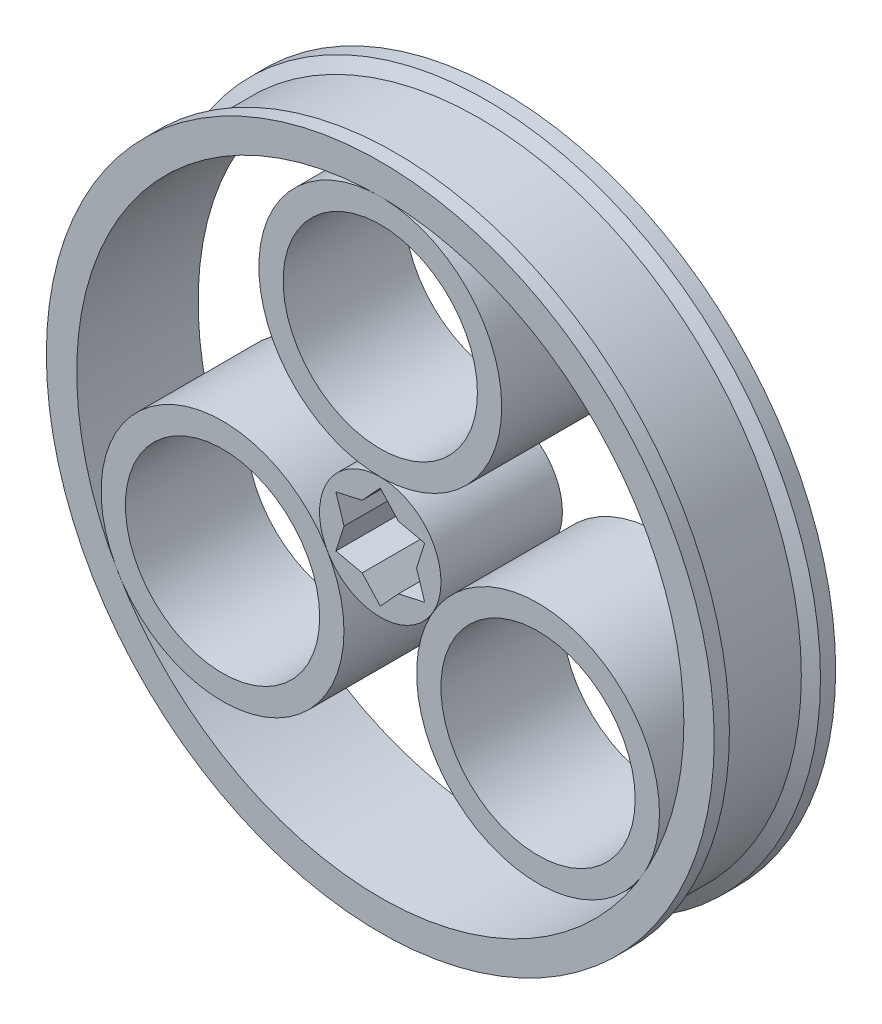
ISO-10303-21;
HEADER;
FILE_DESCRIPTION(('STEP AP214'),'2;1');
FILE_NAME('part.step','',(''),(''),'','','');
FILE_SCHEMA(('AUTOMOTIVE_DESIGN { 1 0 10303 214 1 1 1 1 }'));
ENDSEC;
DATA;
#1=APPLICATION_CONTEXT('core data for automotive mechanical design processes');
#2=APPLICATION_PROTOCOL_DEFINITION('international standard','automotive_design',2000,#1);
#3=PRODUCT_CONTEXT('',#1,'mechanical');
#4=PRODUCT('Part','Part','',(#3));
#5=PRODUCT_RELATED_PRODUCT_CATEGORY('part','',(#4));
#6=PRODUCT_DEFINITION_FORMATION('','',#4);
#7=PRODUCT_DEFINITION_CONTEXT('part definition',#1,'design');
#8=PRODUCT_DEFINITION('design','',#6,#7);
#9=PRODUCT_DEFINITION_SHAPE('','',#8);
#10=(LENGTH_UNIT() NAMED_UNIT(*) SI_UNIT(.MILLI.,.METRE.));
#11=(NAMED_UNIT(*) PLANE_ANGLE_UNIT() SI_UNIT($,.RADIAN.));
#12=(NAMED_UNIT(*) SI_UNIT($,.STERADIAN.) SOLID_ANGLE_UNIT());
#13=UNCERTAINTY_MEASURE_WITH_UNIT(LENGTH_MEASURE(1.E-05),#10,'distance_accuracy_value','');
#14=(GEOMETRIC_REPRESENTATION_CONTEXT(3) GLOBAL_UNCERTAINTY_ASSIGNED_CONTEXT((#13)) GLOBAL_UNIT_ASSIGNED_CONTEXT((#10,
#11,#12)) REPRESENTATION_CONTEXT('',''));
#15=CARTESIAN_POINT('',(0.,0.,0.));
#16=DIRECTION('',(0.,0.,1.));
#17=DIRECTION('',(1.,0.,0.));
#18=AXIS2_PLACEMENT_3D('',#15,#16,#17);
#19=CARTESIAN_POINT('',(0.,0.,10.));
#20=DIRECTION('',(0.,0.,1.));
#21=DIRECTION('',(1.,0.,0.));
#22=AXIS2_PLACEMENT_3D('',#19,#20,#21);
#23=PLANE('',#22);
#24=DIRECTION('',(-0.300705799504273,-0.953716950748227,0.));
#25=VECTOR('',#24,1.);
#26=CARTESIAN_POINT('',(3.653357276294,2.10926680691422,10.));
#27=LINE('',#26,#25);
#28=CARTESIAN_POINT('',(3.653357276294,2.10926680691422,10.));
#29=VERTEX_POINT('',#28);
#30=CARTESIAN_POINT('',(2.98830800665131,0.,10.));
#31=VERTEX_POINT('',#30);
#32=EDGE_CURVE('E200',#29,#31,#27,.T.);
#33=ORIENTED_EDGE('',*,*,#32,.T.);
#34=DIRECTION('',(0.300705799504271,-0.953716950748228,0.));
#35=VECTOR('',#34,1.);
#36=CARTESIAN_POINT('',(2.98830800665131,0.,10.));
#37=LINE('',#36,#35);
#38=CARTESIAN_POINT('',(3.653357276294,-2.10926680691422,10.));
#39=VERTEX_POINT('',#38);
#40=EDGE_CURVE('E187',#31,#39,#37,.T.);
#41=ORIENTED_EDGE('',*,*,#40,.T.);
#42=DIRECTION('',(-0.976296007119933,-0.216439613938103,0.));
#43=VECTOR('',#42,1.);
#44=CARTESIAN_POINT('',(3.653357276294,-2.10926680691422,10.));
#45=LINE('',#44,#43);
#46=CARTESIAN_POINT('',(1.49415400332566,-2.58795064809247,10.));
#47=VERTEX_POINT('',#46);
#48=EDGE_CURVE('E249',#39,#47,#45,.T.);
#49=ORIENTED_EDGE('',*,*,#48,.T.);
#50=DIRECTION('',(-0.675590207615662,-0.737277336810123,0.));
#51=VECTOR('',#50,1.);
#52=CARTESIAN_POINT('',(1.49415400332566,-2.58795064809247,10.));
#53=LINE('',#52,#51);
#54=CARTESIAN_POINT('',(0.,-4.21853361382844,10.));
#55=VERTEX_POINT('',#54);
#56=EDGE_CURVE('E245',#47,#55,#53,.T.);
#57=ORIENTED_EDGE('',*,*,#56,.T.);
#58=DIRECTION('',(-0.675590207615661,0.737277336810123,0.));
#59=VECTOR('',#58,1.);
#60=CARTESIAN_POINT('',(0.,-4.21853361382844,10.));
#61=LINE('',#60,#59);
#62=CARTESIAN_POINT('',(-1.49415400332565,-2.58795064809247,10.));
#63=VERTEX_POINT('',#62);
#64=EDGE_CURVE('E241',#55,#63,#61,.T.);
#65=ORIENTED_EDGE('',*,*,#64,.T.);
#66=DIRECTION('',(-0.976296007119933,0.216439613938105,0.));
#67=VECTOR('',#66,1.);
#68=CARTESIAN_POINT('',(-1.49415400332565,-2.58795064809247,10.));
#69=LINE('',#68,#67);
#70=CARTESIAN_POINT('',(-3.653357276294,-2.10926680691422,10.));
#71=VERTEX_POINT('',#70);
#72=EDGE_CURVE('E237',#63,#71,#69,.T.);
#73=ORIENTED_EDGE('',*,*,#72,.T.);
#74=DIRECTION('',(0.300705799504272,0.953716950748227,0.));
#75=VECTOR('',#74,1.);
#76=CARTESIAN_POINT('',(-3.653357276294,-2.10926680691422,10.));
#77=LINE('',#76,#75);
#78=CARTESIAN_POINT('',(-2.98830800665131,0.,10.));
#79=VERTEX_POINT('',#78);
#80=EDGE_CURVE('E233',#71,#79,#77,.T.);
#81=ORIENTED_EDGE('',*,*,#80,.T.);
#82=DIRECTION('',(-0.300705799504272,0.953716950748227,0.));
#83=VECTOR('',#82,1.);
#84=CARTESIAN_POINT('',(-2.98830800665131,0.,10.));
#85=LINE('',#84,#83);
#86=CARTESIAN_POINT('',(-3.653357276294,2.10926680691422,10.));
#87=VERTEX_POINT('',#86);
#88=EDGE_CURVE('E229',#79,#87,#85,.T.);
#89=ORIENTED_EDGE('',*,*,#88,.T.);
#90=DIRECTION('',(0.976296007119933,0.216439613938104,0.));
#91=VECTOR('',#90,1.);
#92=CARTESIAN_POINT('',(-3.653357276294,2.10926680691422,10.));
#93=LINE('',#92,#91);
#94=CARTESIAN_POINT('',(-1.49415400332566,2.58795064809247,10.));
#95=VERTEX_POINT('',#94);
#96=EDGE_CURVE('E225',#87,#95,#93,.T.);
#97=ORIENTED_EDGE('',*,*,#96,.T.);
#98=DIRECTION('',(0.675590207615662,0.737277336810123,0.));
#99=VECTOR('',#98,1.);
#100=CARTESIAN_POINT('',(-1.49415400332566,2.58795064809247,10.));
#101=LINE('',#100,#99);
#102=CARTESIAN_POINT('',(0.,4.21853361382844,10.));
#103=VERTEX_POINT('',#102);
#104=EDGE_CURVE('E221',#95,#103,#101,.T.);
#105=ORIENTED_EDGE('',*,*,#104,.T.);
#106=DIRECTION('',(0.675590207615661,-0.737277336810123,0.));
#107=VECTOR('',#106,1.);
#108=CARTESIAN_POINT('',(0.,4.21853361382844,10.));
#109=LINE('',#108,#107);
#110=CARTESIAN_POINT('',(1.49415400332565,2.58795064809247,10.));
#111=VERTEX_POINT('',#110);
#112=EDGE_CURVE('E218',#103,#111,#109,.T.);
#113=ORIENTED_EDGE('',*,*,#112,.T.);
#114=DIRECTION('',(0.976296007119933,-0.216439613938105,0.));
#115=VECTOR('',#114,1.);
#116=CARTESIAN_POINT('',(1.49415400332565,2.58795064809247,10.));
#117=LINE('',#116,#115);
#118=EDGE_CURVE('E208',#111,#29,#117,.T.);
#119=ORIENTED_EDGE('',*,*,#118,.T.);
#120=EDGE_LOOP('',(#33,#41,#49,#57,#65,#73,#81,#89,#97,#105,#113,#119));
#121=FACE_BOUND('',#120,.T.);
#122=CARTESIAN_POINT('',(0.,0.,10.));
#123=DIRECTION('',(0.,0.,1.));
#124=DIRECTION('',(1.,0.,0.));
#125=AXIS2_PLACEMENT_3D('',#122,#123,#124);
#126=CIRCLE('',#125,5.);
#127=CARTESIAN_POINT('',(5.,0.,10.));
#128=VERTEX_POINT('',#127);
#129=EDGE_CURVE('E13',#128,#128,#126,.T.);
#130=ORIENTED_EDGE('',*,*,#129,.T.);
#131=EDGE_LOOP('',(#130));
#132=FACE_BOUND('',#131,.T.);
#133=ADVANCED_FACE('F97',(#121,#132),#23,.T.);
#134=CARTESIAN_POINT('',(0.,0.,0.));
#135=DIRECTION('',(0.,0.,1.));
#136=DIRECTION('',(1.,0.,0.));
#137=AXIS2_PLACEMENT_3D('',#134,#135,#136);
#138=PLANE('',#137);
#139=DIRECTION('',(0.300705799504271,-0.953716950748228,0.));
#140=VECTOR('',#139,1.);
#141=CARTESIAN_POINT('',(2.98830800665131,0.,0.));
#142=LINE('',#141,#140);
#143=CARTESIAN_POINT('',(2.98830800665131,0.,0.));
#144=VERTEX_POINT('',#143);
#145=CARTESIAN_POINT('',(3.653357276294,-2.10926680691422,0.));
#146=VERTEX_POINT('',#145);
#147=EDGE_CURVE('E320',#144,#146,#142,.T.);
#148=ORIENTED_EDGE('',*,*,#147,.F.);
#149=DIRECTION('',(-0.300705799504273,-0.953716950748227,0.));
#150=VECTOR('',#149,1.);
#151=CARTESIAN_POINT('',(3.653357276294,2.10926680691422,0.));
#152=LINE('',#151,#150);
#153=CARTESIAN_POINT('',(3.653357276294,2.10926680691422,0.));
#154=VERTEX_POINT('',#153);
#155=EDGE_CURVE('E203',#154,#144,#152,.T.);
#156=ORIENTED_EDGE('',*,*,#155,.F.);
#157=DIRECTION('',(0.976296007119933,-0.216439613938105,0.));
#158=VECTOR('',#157,1.);
#159=CARTESIAN_POINT('',(1.49415400332565,2.58795064809247,0.));
#160=LINE('',#159,#158);
#161=CARTESIAN_POINT('',(1.49415400332565,2.58795064809247,0.));
#162=VERTEX_POINT('',#161);
#163=EDGE_CURVE('E214',#162,#154,#160,.T.);
#164=ORIENTED_EDGE('',*,*,#163,.F.);
#165=DIRECTION('',(0.675590207615661,-0.737277336810123,0.));
#166=VECTOR('',#165,1.);
#167=CARTESIAN_POINT('',(0.,4.21853361382844,0.));
#168=LINE('',#167,#166);
#169=CARTESIAN_POINT('',(0.,4.21853361382844,0.));
#170=VERTEX_POINT('',#169);
#171=EDGE_CURVE('E120',#170,#162,#168,.T.);
#172=ORIENTED_EDGE('',*,*,#171,.F.);
#173=DIRECTION('',(0.675590207615662,0.737277336810123,0.));
#174=VECTOR('',#173,1.);
#175=CARTESIAN_POINT('',(-1.49415400332566,2.58795064809247,0.));
#176=LINE('',#175,#174);
#177=CARTESIAN_POINT('',(-1.49415400332566,2.58795064809247,0.));
#178=VERTEX_POINT('',#177);
#179=EDGE_CURVE('E210',#178,#170,#176,.T.);
#180=ORIENTED_EDGE('',*,*,#179,.F.);
#181=DIRECTION('',(0.976296007119933,0.216439613938104,0.));
#182=VECTOR('',#181,1.);
#183=CARTESIAN_POINT('',(-3.653357276294,2.10926680691422,0.));
#184=LINE('',#183,#182);
#185=CARTESIAN_POINT('',(-3.653357276294,2.10926680691422,0.));
#186=VERTEX_POINT('',#185);
#187=EDGE_CURVE('E341',#186,#178,#184,.T.);
#188=ORIENTED_EDGE('',*,*,#187,.F.);
#189=DIRECTION('',(-0.300705799504271,0.953716950748227,0.));
#190=VECTOR('',#189,1.);
#191=CARTESIAN_POINT('',(-2.98830800665131,0.,0.));
#192=LINE('',#191,#190);
#193=CARTESIAN_POINT('',(-2.98830800665131,0.,0.));
#194=VERTEX_POINT('',#193);
#195=EDGE_CURVE('E338',#194,#186,#192,.T.);
#196=ORIENTED_EDGE('',*,*,#195,.F.);
#197=DIRECTION('',(0.300705799504272,0.953716950748227,0.));
#198=VECTOR('',#197,1.);
#199=CARTESIAN_POINT('',(-3.653357276294,-2.10926680691422,0.));
#200=LINE('',#199,#198);
#201=CARTESIAN_POINT('',(-3.653357276294,-2.10926680691422,0.));
#202=VERTEX_POINT('',#201);
#203=EDGE_CURVE('E335',#202,#194,#200,.T.);
#204=ORIENTED_EDGE('',*,*,#203,.F.);
#205=DIRECTION('',(-0.976296007119933,0.216439613938105,0.));
#206=VECTOR('',#205,1.);
#207=CARTESIAN_POINT('',(-1.49415400332565,-2.58795064809247,0.));
#208=LINE('',#207,#206);
#209=CARTESIAN_POINT('',(-1.49415400332565,-2.58795064809247,0.));
#210=VERTEX_POINT('',#209);
#211=EDGE_CURVE('E332',#210,#202,#208,.T.);
#212=ORIENTED_EDGE('',*,*,#211,.F.);
#213=DIRECTION('',(-0.675590207615661,0.737277336810124,0.));
#214=VECTOR('',#213,1.);
#215=CARTESIAN_POINT('',(0.,-4.21853361382844,0.));
#216=LINE('',#215,#214);
#217=CARTESIAN_POINT('',(0.,-4.21853361382844,0.));
#218=VERTEX_POINT('',#217);
#219=EDGE_CURVE('E329',#218,#210,#216,.T.);
#220=ORIENTED_EDGE('',*,*,#219,.F.);
#221=DIRECTION('',(-0.675590207615662,-0.737277336810123,0.));
#222=VECTOR('',#221,1.);
#223=CARTESIAN_POINT('',(1.49415400332566,-2.58795064809247,0.));
#224=LINE('',#223,#222);
#225=CARTESIAN_POINT('',(1.49415400332566,-2.58795064809247,0.));
#226=VERTEX_POINT('',#225);
#227=EDGE_CURVE('E326',#226,#218,#224,.T.);
#228=ORIENTED_EDGE('',*,*,#227,.F.);
#229=DIRECTION('',(-0.976296007119933,-0.216439613938103,0.));
#230=VECTOR('',#229,1.);
#231=CARTESIAN_POINT('',(3.653357276294,-2.10926680691422,0.));
#232=LINE('',#231,#230);
#233=EDGE_CURVE('E321',#146,#226,#232,.T.);
#234=ORIENTED_EDGE('',*,*,#233,.F.);
#235=EDGE_LOOP('',(#148,#156,#164,#172,#180,#188,#196,#204,#212,#220,#228,#234));
#236=FACE_BOUND('',#235,.T.);
#237=CARTESIAN_POINT('',(0.,0.,0.));
#238=DIRECTION('',(0.,0.,1.));
#239=DIRECTION('',(1.,0.,0.));
#240=AXIS2_PLACEMENT_3D('',#237,#238,#239);
#241=CIRCLE('',#240,5.);
#242=CARTESIAN_POINT('',(5.,0.,0.));
#243=VERTEX_POINT('',#242);
#244=EDGE_CURVE('E101',#243,#243,#241,.T.);
#245=ORIENTED_EDGE('',*,*,#244,.F.);
#246=EDGE_LOOP('',(#245));
#247=FACE_BOUND('',#246,.T.);
#248=ADVANCED_FACE('F265',(#236,#247),#138,.F.);
#249=CARTESIAN_POINT('',(0.,0.,10.));
#250=DIRECTION('',(0.,0.,-1.));
#251=DIRECTION('',(-1.,0.,0.));
#252=AXIS2_PLACEMENT_3D('',#249,#250,#251);
#253=CYLINDRICAL_SURFACE('',#252,5.);
#254=ORIENTED_EDGE('',*,*,#129,.F.);
#255=EDGE_LOOP('',(#254));
#256=FACE_BOUND('',#255,.T.);
#257=ORIENTED_EDGE('',*,*,#244,.T.);
#258=EDGE_LOOP('',(#257));
#259=FACE_BOUND('',#258,.T.);
#260=ADVANCED_FACE('F99',(#256,#259),#253,.T.);
#261=CARTESIAN_POINT('',(3.653357276294,2.10926680691422,21.1611908395566));
#262=DIRECTION('',(0.953716950748227,-0.300705799504273,0.));
#263=DIRECTION('',(0.300705799504273,0.953716950748227,0.));
#264=AXIS2_PLACEMENT_3D('',#261,#262,#263);
#265=PLANE('',#264);
#266=DIRECTION('',(0.,0.,-1.));
#267=VECTOR('',#266,1.);
#268=CARTESIAN_POINT('',(3.653357276294,2.10926680691422,21.1611908395566));
#269=LINE('',#268,#267);
#270=EDGE_CURVE('E112',#29,#154,#269,.T.);
#271=ORIENTED_EDGE('',*,*,#270,.T.);
#272=ORIENTED_EDGE('',*,*,#155,.T.);
#273=DIRECTION('',(0.,0.,-1.));
#274=VECTOR('',#273,1.);
#275=CARTESIAN_POINT('',(2.98830800665131,0.,21.1611908395566));
#276=LINE('',#275,#274);
#277=EDGE_CURVE('E191',#31,#144,#276,.T.);
#278=ORIENTED_EDGE('',*,*,#277,.F.);
#279=ORIENTED_EDGE('',*,*,#32,.F.);
#280=EDGE_LOOP('',(#271,#272,#278,#279));
#281=FACE_BOUND('',#280,.T.);
#282=ADVANCED_FACE('F199',(#281),#265,.F.);
#283=CARTESIAN_POINT('',(2.98830800665131,0.,21.1611908395566));
#284=DIRECTION('',(0.953716950748228,0.300705799504271,0.));
#285=DIRECTION('',(-0.300705799504271,0.953716950748228,0.));
#286=AXIS2_PLACEMENT_3D('',#283,#284,#285);
#287=PLANE('',#286);
#288=ORIENTED_EDGE('',*,*,#277,.T.);
#289=ORIENTED_EDGE('',*,*,#147,.T.);
#290=DIRECTION('',(0.,0.,-1.));
#291=VECTOR('',#290,1.);
#292=CARTESIAN_POINT('',(3.653357276294,-2.10926680691422,21.1611908395566));
#293=LINE('',#292,#291);
#294=EDGE_CURVE('E193',#39,#146,#293,.T.);
#295=ORIENTED_EDGE('',*,*,#294,.F.);
#296=ORIENTED_EDGE('',*,*,#40,.F.);
#297=EDGE_LOOP('',(#288,#289,#295,#296));
#298=FACE_BOUND('',#297,.T.);
#299=ADVANCED_FACE('F189',(#298),#287,.F.);
#300=CARTESIAN_POINT('',(3.653357276294,-2.10926680691422,21.1611908395566));
#301=DIRECTION('',(0.216439613938103,-0.976296007119933,0.));
#302=DIRECTION('',(0.976296007119933,0.216439613938103,0.));
#303=AXIS2_PLACEMENT_3D('',#300,#301,#302);
#304=PLANE('',#303);
#305=ORIENTED_EDGE('',*,*,#294,.T.);
#306=ORIENTED_EDGE('',*,*,#233,.T.);
#307=DIRECTION('',(0.,0.,-1.));
#308=VECTOR('',#307,1.);
#309=CARTESIAN_POINT('',(1.49415400332566,-2.58795064809247,21.1611908395566));
#310=LINE('',#309,#308);
#311=EDGE_CURVE('E248',#47,#226,#310,.T.);
#312=ORIENTED_EDGE('',*,*,#311,.F.);
#313=ORIENTED_EDGE('',*,*,#48,.F.);
#314=EDGE_LOOP('',(#305,#306,#312,#313));
#315=FACE_BOUND('',#314,.T.);
#316=ADVANCED_FACE('F279',(#315),#304,.F.);
#317=CARTESIAN_POINT('',(1.49415400332566,-2.58795064809247,21.1611908395566));
#318=DIRECTION('',(0.737277336810123,-0.675590207615662,0.));
#319=DIRECTION('',(0.675590207615662,0.737277336810123,0.));
#320=AXIS2_PLACEMENT_3D('',#317,#318,#319);
#321=PLANE('',#320);
#322=ORIENTED_EDGE('',*,*,#311,.T.);
#323=ORIENTED_EDGE('',*,*,#227,.T.);
#324=DIRECTION('',(0.,0.,-1.));
#325=VECTOR('',#324,1.);
#326=CARTESIAN_POINT('',(0.,-4.21853361382844,21.1611908395566));
#327=LINE('',#326,#325);
#328=EDGE_CURVE('E244',#55,#218,#327,.T.);
#329=ORIENTED_EDGE('',*,*,#328,.F.);
#330=ORIENTED_EDGE('',*,*,#56,.F.);
#331=EDGE_LOOP('',(#322,#323,#329,#330));
#332=FACE_BOUND('',#331,.T.);
#333=ADVANCED_FACE('F282',(#332),#321,.F.);
#334=CARTESIAN_POINT('',(0.,-4.21853361382844,21.1611908395566));
#335=DIRECTION('',(-0.737277336810123,-0.675590207615661,0.));
#336=DIRECTION('',(0.675590207615661,-0.737277336810123,0.));
#337=AXIS2_PLACEMENT_3D('',#334,#335,#336);
#338=PLANE('',#337);
#339=ORIENTED_EDGE('',*,*,#328,.T.);
#340=ORIENTED_EDGE('',*,*,#219,.T.);
#341=DIRECTION('',(0.,0.,-1.));
#342=VECTOR('',#341,1.);
#343=CARTESIAN_POINT('',(-1.49415400332565,-2.58795064809247,21.1611908395566));
#344=LINE('',#343,#342);
#345=EDGE_CURVE('E240',#63,#210,#344,.T.);
#346=ORIENTED_EDGE('',*,*,#345,.F.);
#347=ORIENTED_EDGE('',*,*,#64,.F.);
#348=EDGE_LOOP('',(#339,#340,#346,#347));
#349=FACE_BOUND('',#348,.T.);
#350=ADVANCED_FACE('F286',(#349),#338,.F.);
#351=CARTESIAN_POINT('',(-1.49415400332565,-2.58795064809247,21.1611908395566));
#352=DIRECTION('',(-0.216439613938105,-0.976296007119933,0.));
#353=DIRECTION('',(0.976296007119933,-0.216439613938105,0.));
#354=AXIS2_PLACEMENT_3D('',#351,#352,#353);
#355=PLANE('',#354);
#356=ORIENTED_EDGE('',*,*,#345,.T.);
#357=ORIENTED_EDGE('',*,*,#211,.T.);
#358=DIRECTION('',(0.,0.,-1.));
#359=VECTOR('',#358,1.);
#360=CARTESIAN_POINT('',(-3.653357276294,-2.10926680691422,21.1611908395566));
#361=LINE('',#360,#359);
#362=EDGE_CURVE('E236',#71,#202,#361,.T.);
#363=ORIENTED_EDGE('',*,*,#362,.F.);
#364=ORIENTED_EDGE('',*,*,#72,.F.);
#365=EDGE_LOOP('',(#356,#357,#363,#364));
#366=FACE_BOUND('',#365,.T.);
#367=ADVANCED_FACE('F290',(#366),#355,.F.);
#368=CARTESIAN_POINT('',(-3.653357276294,-2.10926680691422,21.1611908395566));
#369=DIRECTION('',(-0.953716950748227,0.300705799504272,0.));
#370=DIRECTION('',(-0.300705799504272,-0.953716950748227,0.));
#371=AXIS2_PLACEMENT_3D('',#368,#369,#370);
#372=PLANE('',#371);
#373=ORIENTED_EDGE('',*,*,#362,.T.);
#374=ORIENTED_EDGE('',*,*,#203,.T.);
#375=DIRECTION('',(0.,0.,-1.));
#376=VECTOR('',#375,1.);
#377=CARTESIAN_POINT('',(-2.98830800665131,0.,21.1611908395566));
#378=LINE('',#377,#376);
#379=EDGE_CURVE('E232',#79,#194,#378,.T.);
#380=ORIENTED_EDGE('',*,*,#379,.F.);
#381=ORIENTED_EDGE('',*,*,#80,.F.);
#382=EDGE_LOOP('',(#373,#374,#380,#381));
#383=FACE_BOUND('',#382,.T.);
#384=ADVANCED_FACE('F294',(#383),#372,.F.);
#385=CARTESIAN_POINT('',(-2.98830800665131,0.,21.1611908395566));
#386=DIRECTION('',(-0.953716950748227,-0.300705799504272,0.));
#387=DIRECTION('',(0.300705799504272,-0.953716950748227,0.));
#388=AXIS2_PLACEMENT_3D('',#385,#386,#387);
#389=PLANE('',#388);
#390=ORIENTED_EDGE('',*,*,#379,.T.);
#391=ORIENTED_EDGE('',*,*,#195,.T.);
#392=DIRECTION('',(0.,0.,-1.));
#393=VECTOR('',#392,1.);
#394=CARTESIAN_POINT('',(-3.653357276294,2.10926680691422,21.1611908395566));
#395=LINE('',#394,#393);
#396=EDGE_CURVE('E228',#87,#186,#395,.T.);
#397=ORIENTED_EDGE('',*,*,#396,.F.);
#398=ORIENTED_EDGE('',*,*,#88,.F.);
#399=EDGE_LOOP('',(#390,#391,#397,#398));
#400=FACE_BOUND('',#399,.T.);
#401=ADVANCED_FACE('F298',(#400),#389,.F.);
#402=CARTESIAN_POINT('',(-3.653357276294,2.10926680691422,21.1611908395566));
#403=DIRECTION('',(-0.216439613938104,0.976296007119933,0.));
#404=DIRECTION('',(-0.976296007119933,-0.216439613938104,0.));
#405=AXIS2_PLACEMENT_3D('',#402,#403,#404);
#406=PLANE('',#405);
#407=ORIENTED_EDGE('',*,*,#396,.T.);
#408=ORIENTED_EDGE('',*,*,#187,.T.);
#409=DIRECTION('',(0.,0.,-1.));
#410=VECTOR('',#409,1.);
#411=CARTESIAN_POINT('',(-1.49415400332566,2.58795064809247,21.1611908395566));
#412=LINE('',#411,#410);
#413=EDGE_CURVE('E224',#95,#178,#412,.T.);
#414=ORIENTED_EDGE('',*,*,#413,.F.);
#415=ORIENTED_EDGE('',*,*,#96,.F.);
#416=EDGE_LOOP('',(#407,#408,#414,#415));
#417=FACE_BOUND('',#416,.T.);
#418=ADVANCED_FACE('F302',(#417),#406,.F.);
#419=CARTESIAN_POINT('',(-1.49415400332566,2.58795064809247,21.1611908395566));
#420=DIRECTION('',(-0.737277336810123,0.675590207615662,0.));
#421=DIRECTION('',(-0.675590207615662,-0.737277336810123,0.));
#422=AXIS2_PLACEMENT_3D('',#419,#420,#421);
#423=PLANE('',#422);
#424=ORIENTED_EDGE('',*,*,#413,.T.);
#425=ORIENTED_EDGE('',*,*,#179,.T.);
#426=DIRECTION('',(0.,0.,-1.));
#427=VECTOR('',#426,1.);
#428=CARTESIAN_POINT('',(0.,4.21853361382844,21.1611908395566));
#429=LINE('',#428,#427);
#430=EDGE_CURVE('E220',#103,#170,#429,.T.);
#431=ORIENTED_EDGE('',*,*,#430,.F.);
#432=ORIENTED_EDGE('',*,*,#104,.F.);
#433=EDGE_LOOP('',(#424,#425,#431,#432));
#434=FACE_BOUND('',#433,.T.);
#435=ADVANCED_FACE('F306',(#434),#423,.F.);
#436=CARTESIAN_POINT('',(0.,4.21853361382844,21.1611908395566));
#437=DIRECTION('',(0.737277336810123,0.675590207615661,0.));
#438=DIRECTION('',(-0.675590207615661,0.737277336810123,0.));
#439=AXIS2_PLACEMENT_3D('',#436,#437,#438);
#440=PLANE('',#439);
#441=ORIENTED_EDGE('',*,*,#430,.T.);
#442=ORIENTED_EDGE('',*,*,#171,.T.);
#443=DIRECTION('',(0.,0.,-1.));
#444=VECTOR('',#443,1.);
#445=CARTESIAN_POINT('',(1.49415400332565,2.58795064809247,21.1611908395566));
#446=LINE('',#445,#444);
#447=EDGE_CURVE('E217',#111,#162,#446,.T.);
#448=ORIENTED_EDGE('',*,*,#447,.F.);
#449=ORIENTED_EDGE('',*,*,#112,.F.);
#450=EDGE_LOOP('',(#441,#442,#448,#449));
#451=FACE_BOUND('',#450,.T.);
#452=ADVANCED_FACE('F310',(#451),#440,.F.);
#453=CARTESIAN_POINT('',(1.49415400332565,2.58795064809247,21.1611908395566));
#454=DIRECTION('',(0.216439613938105,0.976296007119933,0.));
#455=DIRECTION('',(-0.976296007119933,0.216439613938105,0.));
#456=AXIS2_PLACEMENT_3D('',#453,#454,#455);
#457=PLANE('',#456);
#458=ORIENTED_EDGE('',*,*,#447,.T.);
#459=ORIENTED_EDGE('',*,*,#163,.T.);
#460=ORIENTED_EDGE('',*,*,#270,.F.);
#461=ORIENTED_EDGE('',*,*,#118,.F.);
#462=EDGE_LOOP('',(#458,#459,#460,#461));
#463=FACE_BOUND('',#462,.T.);
#464=ADVANCED_FACE('F314',(#463),#457,.F.);
#465=CLOSED_SHELL('',(#133,#248,#260,#282,#299,#316,#333,#350,#367,#384,#401,#418,#435,#452,#464));
#466=MANIFOLD_SOLID_BREP('B2',#465);
#467=CARTESIAN_POINT('',(0.,0.,10.));
#468=DIRECTION('',(0.,0.,-1.));
#469=DIRECTION('',(-1.,0.,0.));
#470=AXIS2_PLACEMENT_3D('',#467,#468,#469);
#471=CYLINDRICAL_SURFACE('',#470,27.5);
#472=CARTESIAN_POINT('',(0.,0.,10.));
#473=DIRECTION('',(0.,0.,1.));
#474=DIRECTION('',(1.,0.,0.));
#475=AXIS2_PLACEMENT_3D('',#472,#473,#474);
#476=CIRCLE('',#475,27.5);
#477=CARTESIAN_POINT('',(27.5,0.,10.));
#478=VERTEX_POINT('',#477);
#479=EDGE_CURVE('E96',#478,#478,#476,.T.);
#480=ORIENTED_EDGE('',*,*,#479,.F.);
#481=EDGE_LOOP('',(#480));
#482=FACE_BOUND('',#481,.T.);
#483=CARTESIAN_POINT('',(0.,0.,8.75));
#484=DIRECTION('',(0.,0.,1.));
#485=DIRECTION('',(1.,0.,0.));
#486=AXIS2_PLACEMENT_3D('',#483,#484,#485);
#487=CIRCLE('',#486,27.5);
#488=CARTESIAN_POINT('',(27.5,0.,8.75));
#489=VERTEX_POINT('',#488);
#490=EDGE_CURVE('E479',#489,#489,#487,.T.);
#491=ORIENTED_EDGE('',*,*,#490,.T.);
#492=EDGE_LOOP('',(#491));
#493=FACE_BOUND('',#492,.T.);
#494=ADVANCED_FACE('F457',(#482,#493),#471,.T.);
#495=CARTESIAN_POINT('',(0.,0.,10.));
#496=DIRECTION('',(0.,0.,-1.));
#497=DIRECTION('',(-1.,0.,0.));
#498=AXIS2_PLACEMENT_3D('',#495,#496,#497);
#499=CYLINDRICAL_SURFACE('',#498,25.);
#500=CARTESIAN_POINT('',(0.,0.,10.));
#501=DIRECTION('',(0.,0.,1.));
#502=DIRECTION('',(1.,0.,0.));
#503=AXIS2_PLACEMENT_3D('',#500,#501,#502);
#504=CIRCLE('',#503,25.);
#505=CARTESIAN_POINT('',(25.,0.,10.));
#506=VERTEX_POINT('',#505);
#507=EDGE_CURVE('E465',#506,#506,#504,.T.);
#508=ORIENTED_EDGE('',*,*,#507,.T.);
#509=EDGE_LOOP('',(#508));
#510=FACE_BOUND('',#509,.T.);
#511=CARTESIAN_POINT('',(0.,0.,0.));
#512=DIRECTION('',(0.,0.,1.));
#513=DIRECTION('',(1.,0.,0.));
#514=AXIS2_PLACEMENT_3D('',#511,#512,#513);
#515=CIRCLE('',#514,25.);
#516=CARTESIAN_POINT('',(25.,0.,0.));
#517=VERTEX_POINT('',#516);
#518=EDGE_CURVE('E472',#517,#517,#515,.T.);
#519=ORIENTED_EDGE('',*,*,#518,.F.);
#520=EDGE_LOOP('',(#519));
#521=FACE_BOUND('',#520,.T.);
#522=ADVANCED_FACE('F459',(#510,#521),#499,.F.);
#523=CARTESIAN_POINT('',(0.,0.,1.25));
#524=DIRECTION('',(0.,0.,1.));
#525=DIRECTION('',(1.,0.,0.));
#526=AXIS2_PLACEMENT_3D('',#523,#524,#525);
#527=CIRCLE('',#526,27.5);
#528=CARTESIAN_POINT('',(27.5,0.,1.25));
#529=VERTEX_POINT('',#528);
#530=EDGE_CURVE('E474',#529,#529,#527,.T.);
#531=ORIENTED_EDGE('',*,*,#530,.F.);
#532=EDGE_LOOP('',(#531));
#533=FACE_BOUND('',#532,.T.);
#534=CARTESIAN_POINT('',(0.,0.,0.));
#535=DIRECTION('',(0.,0.,1.));
#536=DIRECTION('',(1.,0.,0.));
#537=AXIS2_PLACEMENT_3D('',#534,#535,#536);
#538=CIRCLE('',#537,27.5);
#539=CARTESIAN_POINT('',(27.5,0.,0.));
#540=VERTEX_POINT('',#539);
#541=EDGE_CURVE('E461',#540,#540,#538,.T.);
#542=ORIENTED_EDGE('',*,*,#541,.T.);
#543=EDGE_LOOP('',(#542));
#544=FACE_BOUND('',#543,.T.);
#545=ADVANCED_FACE('F512',(#533,#544),#471,.T.);
#546=CARTESIAN_POINT('',(0.,0.,10.));
#547=DIRECTION('',(0.,0.,1.));
#548=DIRECTION('',(1.,0.,0.));
#549=AXIS2_PLACEMENT_3D('',#546,#547,#548);
#550=PLANE('',#549);
#551=ORIENTED_EDGE('',*,*,#507,.F.);
#552=EDGE_LOOP('',(#551));
#553=FACE_BOUND('',#552,.T.);
#554=ORIENTED_EDGE('',*,*,#479,.T.);
#555=EDGE_LOOP('',(#554));
#556=FACE_BOUND('',#555,.T.);
#557=ADVANCED_FACE('F507',(#553,#556),#550,.T.);
#558=CARTESIAN_POINT('',(0.,0.,0.));
#559=DIRECTION('',(0.,0.,1.));
#560=DIRECTION('',(1.,0.,0.));
#561=AXIS2_PLACEMENT_3D('',#558,#559,#560);
#562=PLANE('',#561);
#563=ORIENTED_EDGE('',*,*,#518,.T.);
#564=EDGE_LOOP('',(#563));
#565=FACE_BOUND('',#564,.T.);
#566=ORIENTED_EDGE('',*,*,#541,.F.);
#567=EDGE_LOOP('',(#566));
#568=FACE_BOUND('',#567,.T.);
#569=ADVANCED_FACE('F498',(#565,#568),#562,.F.);
#570=CARTESIAN_POINT('',(0.,0.,1.25));
#571=DIRECTION('',(0.,0.,-1.));
#572=DIRECTION('',(-1.,0.,0.));
#573=AXIS2_PLACEMENT_3D('',#570,#571,#572);
#574=CONICAL_SURFACE('',#573,27.5,1.04719755119659);
#575=CARTESIAN_POINT('',(0.,0.,1.82735026918964));
#576=DIRECTION('',(0.,0.,1.));
#577=DIRECTION('',(1.,0.,0.));
#578=AXIS2_PLACEMENT_3D('',#575,#576,#577);
#579=CIRCLE('',#578,26.5);
#580=CARTESIAN_POINT('',(26.5,0.,1.82735026918964));
#581=VERTEX_POINT('',#580);
#582=EDGE_CURVE('E488',#581,#581,#579,.T.);
#583=ORIENTED_EDGE('',*,*,#582,.F.);
#584=EDGE_LOOP('',(#583));
#585=FACE_BOUND('',#584,.T.);
#586=ORIENTED_EDGE('',*,*,#530,.T.);
#587=EDGE_LOOP('',(#586));
#588=FACE_BOUND('',#587,.T.);
#589=ADVANCED_FACE('F495',(#585,#588),#574,.T.);
#590=CARTESIAN_POINT('',(0.,0.,8.75));
#591=DIRECTION('',(0.,0.,1.));
#592=DIRECTION('',(1.,0.,0.));
#593=AXIS2_PLACEMENT_3D('',#590,#591,#592);
#594=CONICAL_SURFACE('',#593,27.5,1.04719755119659);
#595=CARTESIAN_POINT('',(0.,0.,8.17264973081037));
#596=DIRECTION('',(0.,0.,1.));
#597=DIRECTION('',(1.,0.,0.));
#598=AXIS2_PLACEMENT_3D('',#595,#596,#597);
#599=CIRCLE('',#598,26.5);
#600=CARTESIAN_POINT('',(26.5,0.,8.17264973081037));
#601=VERTEX_POINT('',#600);
#602=EDGE_CURVE('E483',#601,#601,#599,.T.);
#603=ORIENTED_EDGE('',*,*,#602,.T.);
#604=EDGE_LOOP('',(#603));
#605=FACE_BOUND('',#604,.T.);
#606=ORIENTED_EDGE('',*,*,#490,.F.);
#607=EDGE_LOOP('',(#606));
#608=FACE_BOUND('',#607,.T.);
#609=ADVANCED_FACE('F497',(#605,#608),#594,.T.);
#610=CARTESIAN_POINT('',(0.,0.,5.));
#611=DIRECTION('',(0.,0.,1.));
#612=DIRECTION('',(1.,0.,0.));
#613=AXIS2_PLACEMENT_3D('',#610,#611,#612);
#614=CYLINDRICAL_SURFACE('',#613,26.5);
#615=ORIENTED_EDGE('',*,*,#582,.T.);
#616=EDGE_LOOP('',(#615));
#617=FACE_BOUND('',#616,.T.);
#618=ORIENTED_EDGE('',*,*,#602,.F.);
#619=EDGE_LOOP('',(#618));
#620=FACE_BOUND('',#619,.T.);
#621=ADVANCED_FACE('F492',(#617,#620),#614,.T.);
#622=CLOSED_SHELL('',(#494,#522,#545,#557,#569,#589,#609,#621));
#623=MANIFOLD_SOLID_BREP('B7',#622);
#624=CARTESIAN_POINT('',(12.9903810567666,-7.5,10.));
#625=DIRECTION('',(0.,0.,-1.));
#626=DIRECTION('',(-1.,0.,0.));
#627=AXIS2_PLACEMENT_3D('',#624,#625,#626);
#628=CYLINDRICAL_SURFACE('',#627,8.);
#629=CARTESIAN_POINT('',(12.9903810567666,-7.5,10.));
#630=DIRECTION('',(0.,0.,1.));
#631=DIRECTION('',(1.,0.,0.));
#632=AXIS2_PLACEMENT_3D('',#629,#630,#631);
#633=CIRCLE('',#632,8.);
#634=CARTESIAN_POINT('',(20.9903810567666,-7.5,10.));
#635=VERTEX_POINT('',#634);
#636=EDGE_CURVE('E592',#635,#635,#633,.T.);
#637=ORIENTED_EDGE('',*,*,#636,.T.);
#638=EDGE_LOOP('',(#637));
#639=FACE_BOUND('',#638,.T.);
#640=CARTESIAN_POINT('',(12.9903810567666,-7.5,0.));
#641=DIRECTION('',(0.,0.,1.));
#642=DIRECTION('',(1.,0.,0.));
#643=AXIS2_PLACEMENT_3D('',#640,#641,#642);
#644=CIRCLE('',#643,8.);
#645=CARTESIAN_POINT('',(20.9903810567666,-7.5,0.));
#646=VERTEX_POINT('',#645);
#647=EDGE_CURVE('E598',#646,#646,#644,.T.);
#648=ORIENTED_EDGE('',*,*,#647,.F.);
#649=EDGE_LOOP('',(#648));
#650=FACE_BOUND('',#649,.T.);
#651=ADVANCED_FACE('F585',(#639,#650),#628,.F.);
#652=CARTESIAN_POINT('',(12.9903810567666,-7.5,10.));
#653=DIRECTION('',(0.,0.,-1.));
#654=DIRECTION('',(-1.,0.,0.));
#655=AXIS2_PLACEMENT_3D('',#652,#653,#654);
#656=CYLINDRICAL_SURFACE('',#655,10.);
#657=CARTESIAN_POINT('',(12.9903810567666,-7.5,10.));
#658=DIRECTION('',(0.,0.,1.));
#659=DIRECTION('',(1.,0.,0.));
#660=AXIS2_PLACEMENT_3D('',#657,#658,#659);
#661=CIRCLE('',#660,10.);
#662=CARTESIAN_POINT('',(22.9903810567666,-7.5,10.));
#663=VERTEX_POINT('',#662);
#664=EDGE_CURVE('E456',#663,#663,#661,.T.);
#665=ORIENTED_EDGE('',*,*,#664,.F.);
#666=EDGE_LOOP('',(#665));
#667=FACE_BOUND('',#666,.T.);
#668=CARTESIAN_POINT('',(12.9903810567666,-7.5,0.));
#669=DIRECTION('',(0.,0.,1.));
#670=DIRECTION('',(1.,0.,0.));
#671=AXIS2_PLACEMENT_3D('',#668,#669,#670);
#672=CIRCLE('',#671,10.);
#673=CARTESIAN_POINT('',(22.9903810567666,-7.5,0.));
#674=VERTEX_POINT('',#673);
#675=EDGE_CURVE('E588',#674,#674,#672,.T.);
#676=ORIENTED_EDGE('',*,*,#675,.T.);
#677=EDGE_LOOP('',(#676));
#678=FACE_BOUND('',#677,.T.);
#679=ADVANCED_FACE('F605',(#667,#678),#656,.T.);
#680=CARTESIAN_POINT('',(0.,0.,10.));
#681=DIRECTION('',(0.,0.,1.));
#682=DIRECTION('',(1.,0.,0.));
#683=AXIS2_PLACEMENT_3D('',#680,#681,#682);
#684=PLANE('',#683);
#685=ORIENTED_EDGE('',*,*,#636,.F.);
#686=EDGE_LOOP('',(#685));
#687=FACE_BOUND('',#686,.T.);
#688=ORIENTED_EDGE('',*,*,#664,.T.);
#689=EDGE_LOOP('',(#688));
#690=FACE_BOUND('',#689,.T.);
#691=ADVANCED_FACE('F609',(#687,#690),#684,.T.);
#692=CARTESIAN_POINT('',(0.,0.,0.));
#693=DIRECTION('',(0.,0.,1.));
#694=DIRECTION('',(1.,0.,0.));
#695=AXIS2_PLACEMENT_3D('',#692,#693,#694);
#696=PLANE('',#695);
#697=ORIENTED_EDGE('',*,*,#647,.T.);
#698=EDGE_LOOP('',(#697));
#699=FACE_BOUND('',#698,.T.);
#700=ORIENTED_EDGE('',*,*,#675,.F.);
#701=EDGE_LOOP('',(#700));
#702=FACE_BOUND('',#701,.T.);
#703=ADVANCED_FACE('F607',(#699,#702),#696,.F.);
#704=CLOSED_SHELL('',(#651,#679,#691,#703));
#705=MANIFOLD_SOLID_BREP('B91',#704);
#706=CARTESIAN_POINT('',(-12.9903810567666,-7.5,10.));
#707=DIRECTION('',(0.,0.,-1.));
#708=DIRECTION('',(-1.,0.,0.));
#709=AXIS2_PLACEMENT_3D('',#706,#707,#708);
#710=CYLINDRICAL_SURFACE('',#709,8.);
#711=CARTESIAN_POINT('',(-12.9903810567666,-7.5,10.));
#712=DIRECTION('',(0.,0.,1.));
#713=DIRECTION('',(1.,0.,0.));
#714=AXIS2_PLACEMENT_3D('',#711,#712,#713);
#715=CIRCLE('',#714,8.);
#716=CARTESIAN_POINT('',(-4.99038105676658,-7.5,10.));
#717=VERTEX_POINT('',#716);
#718=EDGE_CURVE('E660',#717,#717,#715,.T.);
#719=ORIENTED_EDGE('',*,*,#718,.T.);
#720=EDGE_LOOP('',(#719));
#721=FACE_BOUND('',#720,.T.);
#722=CARTESIAN_POINT('',(-12.9903810567666,-7.5,0.));
#723=DIRECTION('',(0.,0.,1.));
#724=DIRECTION('',(1.,0.,0.));
#725=AXIS2_PLACEMENT_3D('',#722,#723,#724);
#726=CIRCLE('',#725,8.);
#727=CARTESIAN_POINT('',(-4.99038105676658,-7.5,0.));
#728=VERTEX_POINT('',#727);
#729=EDGE_CURVE('E666',#728,#728,#726,.T.);
#730=ORIENTED_EDGE('',*,*,#729,.F.);
#731=EDGE_LOOP('',(#730));
#732=FACE_BOUND('',#731,.T.);
#733=ADVANCED_FACE('F653',(#721,#732),#710,.F.);
#734=CARTESIAN_POINT('',(-12.9903810567666,-7.5,10.));
#735=DIRECTION('',(0.,0.,-1.));
#736=DIRECTION('',(-1.,0.,0.));
#737=AXIS2_PLACEMENT_3D('',#734,#735,#736);
#738=CYLINDRICAL_SURFACE('',#737,10.);
#739=CARTESIAN_POINT('',(-12.9903810567666,-7.5,10.));
#740=DIRECTION('',(0.,0.,1.));
#741=DIRECTION('',(1.,0.,0.));
#742=AXIS2_PLACEMENT_3D('',#739,#740,#741);
#743=CIRCLE('',#742,10.);
#744=CARTESIAN_POINT('',(-2.99038105676658,-7.5,10.));
#745=VERTEX_POINT('',#744);
#746=EDGE_CURVE('E584',#745,#745,#743,.T.);
#747=ORIENTED_EDGE('',*,*,#746,.F.);
#748=EDGE_LOOP('',(#747));
#749=FACE_BOUND('',#748,.T.);
#750=CARTESIAN_POINT('',(-12.9903810567666,-7.5,0.));
#751=DIRECTION('',(0.,0.,1.));
#752=DIRECTION('',(1.,0.,0.));
#753=AXIS2_PLACEMENT_3D('',#750,#751,#752);
#754=CIRCLE('',#753,10.);
#755=CARTESIAN_POINT('',(-2.99038105676658,-7.5,0.));
#756=VERTEX_POINT('',#755);
#757=EDGE_CURVE('E656',#756,#756,#754,.T.);
#758=ORIENTED_EDGE('',*,*,#757,.T.);
#759=EDGE_LOOP('',(#758));
#760=FACE_BOUND('',#759,.T.);
#761=ADVANCED_FACE('F673',(#749,#760),#738,.T.);
#762=CARTESIAN_POINT('',(0.,0.,10.));
#763=DIRECTION('',(0.,0.,1.));
#764=DIRECTION('',(1.,0.,0.));
#765=AXIS2_PLACEMENT_3D('',#762,#763,#764);
#766=PLANE('',#765);
#767=ORIENTED_EDGE('',*,*,#718,.F.);
#768=EDGE_LOOP('',(#767));
#769=FACE_BOUND('',#768,.T.);
#770=ORIENTED_EDGE('',*,*,#746,.T.);
#771=EDGE_LOOP('',(#770));
#772=FACE_BOUND('',#771,.T.);
#773=ADVANCED_FACE('F677',(#769,#772),#766,.T.);
#774=CARTESIAN_POINT('',(0.,0.,0.));
#775=DIRECTION('',(0.,0.,1.));
#776=DIRECTION('',(1.,0.,0.));
#777=AXIS2_PLACEMENT_3D('',#774,#775,#776);
#778=PLANE('',#777);
#779=ORIENTED_EDGE('',*,*,#729,.T.);
#780=EDGE_LOOP('',(#779));
#781=FACE_BOUND('',#780,.T.);
#782=ORIENTED_EDGE('',*,*,#757,.F.);
#783=EDGE_LOOP('',(#782));
#784=FACE_BOUND('',#783,.T.);
#785=ADVANCED_FACE('F675',(#781,#784),#778,.F.);
#786=CLOSED_SHELL('',(#733,#761,#773,#785));
#787=MANIFOLD_SOLID_BREP('B451',#786);
#788=CARTESIAN_POINT('',(0.,15.,10.));
#789=DIRECTION('',(0.,0.,-1.));
#790=DIRECTION('',(-1.,0.,0.));
#791=AXIS2_PLACEMENT_3D('',#788,#789,#790);
#792=CYLINDRICAL_SURFACE('',#791,8.);
#793=CARTESIAN_POINT('',(0.,15.,10.));
#794=DIRECTION('',(0.,0.,1.));
#795=DIRECTION('',(1.,0.,0.));
#796=AXIS2_PLACEMENT_3D('',#793,#794,#795);
#797=CIRCLE('',#796,8.);
#798=CARTESIAN_POINT('',(8.,15.,10.));
#799=VERTEX_POINT('',#798);
#800=EDGE_CURVE('E721',#799,#799,#797,.T.);
#801=ORIENTED_EDGE('',*,*,#800,.T.);
#802=EDGE_LOOP('',(#801));
#803=FACE_BOUND('',#802,.T.);
#804=CARTESIAN_POINT('',(0.,15.,0.));
#805=DIRECTION('',(0.,0.,1.));
#806=DIRECTION('',(1.,0.,0.));
#807=AXIS2_PLACEMENT_3D('',#804,#805,#806);
#808=CIRCLE('',#807,8.);
#809=CARTESIAN_POINT('',(8.,15.,0.));
#810=VERTEX_POINT('',#809);
#811=EDGE_CURVE('E727',#810,#810,#808,.T.);
#812=ORIENTED_EDGE('',*,*,#811,.F.);
#813=EDGE_LOOP('',(#812));
#814=FACE_BOUND('',#813,.T.);
#815=ADVANCED_FACE('F714',(#803,#814),#792,.F.);
#816=CARTESIAN_POINT('',(0.,15.,10.));
#817=DIRECTION('',(0.,0.,-1.));
#818=DIRECTION('',(-1.,0.,0.));
#819=AXIS2_PLACEMENT_3D('',#816,#817,#818);
#820=CYLINDRICAL_SURFACE('',#819,10.);
#821=CARTESIAN_POINT('',(0.,15.,10.));
#822=DIRECTION('',(0.,0.,1.));
#823=DIRECTION('',(1.,0.,0.));
#824=AXIS2_PLACEMENT_3D('',#821,#822,#823);
#825=CIRCLE('',#824,10.);
#826=CARTESIAN_POINT('',(10.,15.,10.));
#827=VERTEX_POINT('',#826);
#828=EDGE_CURVE('E652',#827,#827,#825,.T.);
#829=ORIENTED_EDGE('',*,*,#828,.F.);
#830=EDGE_LOOP('',(#829));
#831=FACE_BOUND('',#830,.T.);
#832=CARTESIAN_POINT('',(0.,15.,0.));
#833=DIRECTION('',(0.,0.,1.));
#834=DIRECTION('',(1.,0.,0.));
#835=AXIS2_PLACEMENT_3D('',#832,#833,#834);
#836=CIRCLE('',#835,10.);
#837=CARTESIAN_POINT('',(10.,15.,0.));
#838=VERTEX_POINT('',#837);
#839=EDGE_CURVE('E717',#838,#838,#836,.T.);
#840=ORIENTED_EDGE('',*,*,#839,.T.);
#841=EDGE_LOOP('',(#840));
#842=FACE_BOUND('',#841,.T.);
#843=ADVANCED_FACE('F734',(#831,#842),#820,.T.);
#844=CARTESIAN_POINT('',(0.,0.,10.));
#845=DIRECTION('',(0.,0.,1.));
#846=DIRECTION('',(1.,0.,0.));
#847=AXIS2_PLACEMENT_3D('',#844,#845,#846);
#848=PLANE('',#847);
#849=ORIENTED_EDGE('',*,*,#800,.F.);
#850=EDGE_LOOP('',(#849));
#851=FACE_BOUND('',#850,.T.);
#852=ORIENTED_EDGE('',*,*,#828,.T.);
#853=EDGE_LOOP('',(#852));
#854=FACE_BOUND('',#853,.T.);
#855=ADVANCED_FACE('F738',(#851,#854),#848,.T.);
#856=CARTESIAN_POINT('',(0.,0.,0.));
#857=DIRECTION('',(0.,0.,1.));
#858=DIRECTION('',(1.,0.,0.));
#859=AXIS2_PLACEMENT_3D('',#856,#857,#858);
#860=PLANE('',#859);
#861=ORIENTED_EDGE('',*,*,#811,.T.);
#862=EDGE_LOOP('',(#861));
#863=FACE_BOUND('',#862,.T.);
#864=ORIENTED_EDGE('',*,*,#839,.F.);
#865=EDGE_LOOP('',(#864));
#866=FACE_BOUND('',#865,.T.);
#867=ADVANCED_FACE('F736',(#863,#866),#860,.F.);
#868=CLOSED_SHELL('',(#815,#843,#855,#867));
#869=MANIFOLD_SOLID_BREP('B579',#868);
#870=ADVANCED_BREP_SHAPE_REPRESENTATION('',(#18,#466,#623,#705,#787,#869),#14);
#871=SHAPE_DEFINITION_REPRESENTATION(#9,#870);
ENDSEC;
END-ISO-10303-21;
